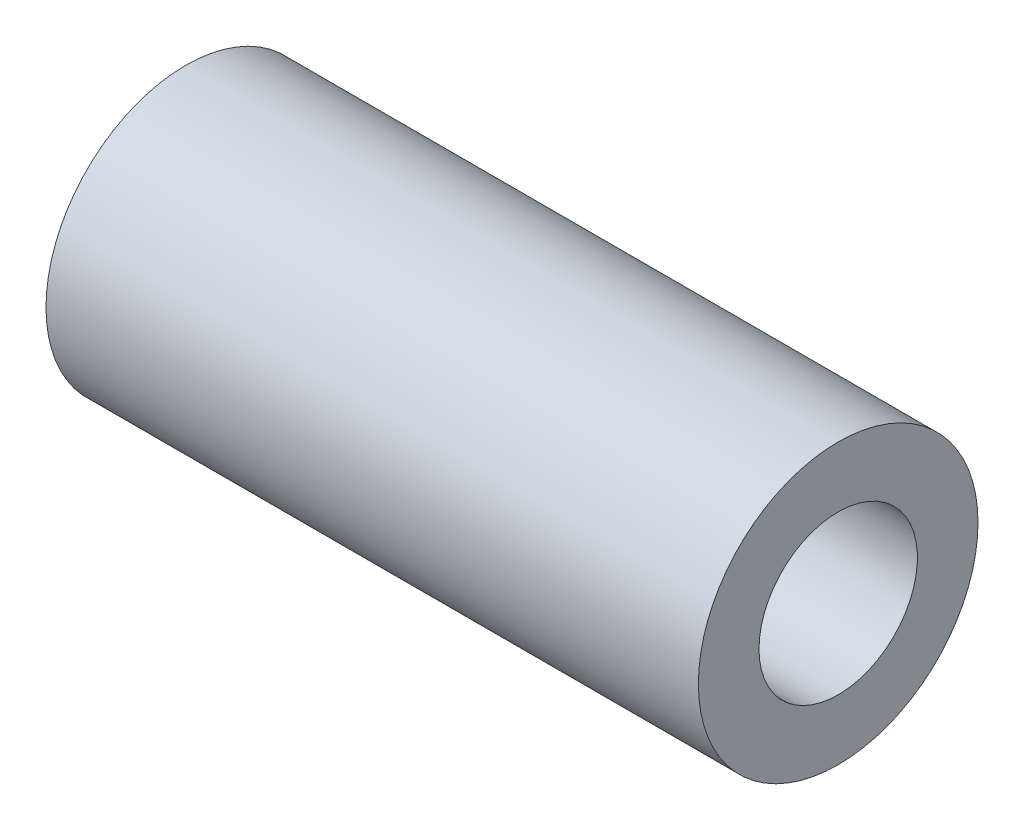
ISO-10303-21;
HEADER;
FILE_DESCRIPTION(('STEP AP214'),'2;1');
FILE_NAME('part.step','',(''),(''),'','','');
FILE_SCHEMA(('AUTOMOTIVE_DESIGN { 1 0 10303 214 1 1 1 1 }'));
ENDSEC;
DATA;
#1=APPLICATION_CONTEXT('core data for automotive mechanical design processes');
#2=APPLICATION_PROTOCOL_DEFINITION('international standard','automotive_design',2000,#1);
#3=PRODUCT_CONTEXT('',#1,'mechanical');
#4=PRODUCT('Part','Part','',(#3));
#5=PRODUCT_RELATED_PRODUCT_CATEGORY('part','',(#4));
#6=PRODUCT_DEFINITION_FORMATION('','',#4);
#7=PRODUCT_DEFINITION_CONTEXT('part definition',#1,'design');
#8=PRODUCT_DEFINITION('design','',#6,#7);
#9=PRODUCT_DEFINITION_SHAPE('','',#8);
#10=(LENGTH_UNIT() NAMED_UNIT(*) SI_UNIT(.MILLI.,.METRE.));
#11=(NAMED_UNIT(*) PLANE_ANGLE_UNIT() SI_UNIT($,.RADIAN.));
#12=(NAMED_UNIT(*) SI_UNIT($,.STERADIAN.) SOLID_ANGLE_UNIT());
#13=UNCERTAINTY_MEASURE_WITH_UNIT(LENGTH_MEASURE(1.E-05),#10,'distance_accuracy_value','');
#14=(GEOMETRIC_REPRESENTATION_CONTEXT(3) GLOBAL_UNCERTAINTY_ASSIGNED_CONTEXT((#13)) GLOBAL_UNIT_ASSIGNED_CONTEXT((#10,
#11,#12)) REPRESENTATION_CONTEXT('',''));
#15=CARTESIAN_POINT('',(0.,0.,0.));
#16=DIRECTION('',(0.,0.,1.));
#17=DIRECTION('',(1.,0.,0.));
#18=AXIS2_PLACEMENT_3D('',#15,#16,#17);
#19=CARTESIAN_POINT('',(-17.,3.,0.));
#20=DIRECTION('',(1.,0.,0.));
#21=DIRECTION('',(0.,0.,-1.));
#22=AXIS2_PLACEMENT_3D('',#19,#20,#21);
#23=PLANE('',#22);
#24=CARTESIAN_POINT('',(-17.,0.,0.));
#25=DIRECTION('',(-1.,0.,0.));
#26=DIRECTION('',(0.,0.,1.));
#27=AXIS2_PLACEMENT_3D('',#24,#25,#26);
#28=CIRCLE('',#27,1.7);
#29=CARTESIAN_POINT('',(-17.,0.,1.7));
#30=VERTEX_POINT('',#29);
#31=EDGE_CURVE('E10',#30,#30,#28,.T.);
#32=ORIENTED_EDGE('',*,*,#31,.F.);
#33=EDGE_LOOP('',(#32));
#34=FACE_BOUND('',#33,.T.);
#35=CARTESIAN_POINT('',(-17.,0.,0.));
#36=DIRECTION('',(-1.,0.,0.));
#37=DIRECTION('',(0.,0.,1.));
#38=AXIS2_PLACEMENT_3D('',#35,#36,#37);
#39=CIRCLE('',#38,3.);
#40=CARTESIAN_POINT('',(-17.,0.,3.));
#41=VERTEX_POINT('',#40);
#42=EDGE_CURVE('E53',#41,#41,#39,.T.);
#43=ORIENTED_EDGE('',*,*,#42,.T.);
#44=EDGE_LOOP('',(#43));
#45=FACE_BOUND('',#44,.T.);
#46=ADVANCED_FACE('F35',(#34,#45),#23,.F.);
#47=CARTESIAN_POINT('',(-60.,0.,0.));
#48=DIRECTION('',(-1.,0.,0.));
#49=DIRECTION('',(0.,0.,1.));
#50=AXIS2_PLACEMENT_3D('',#47,#48,#49);
#51=CYLINDRICAL_SURFACE('',#50,1.7);
#52=CARTESIAN_POINT('',(-3.,0.,0.));
#53=DIRECTION('',(-1.,0.,0.));
#54=DIRECTION('',(0.,0.,1.));
#55=AXIS2_PLACEMENT_3D('',#52,#53,#54);
#56=CIRCLE('',#55,1.7);
#57=CARTESIAN_POINT('',(-3.,0.,1.7));
#58=VERTEX_POINT('',#57);
#59=EDGE_CURVE('E42',#58,#58,#56,.T.);
#60=ORIENTED_EDGE('',*,*,#59,.F.);
#61=EDGE_LOOP('',(#60));
#62=FACE_BOUND('',#61,.T.);
#63=ORIENTED_EDGE('',*,*,#31,.T.);
#64=EDGE_LOOP('',(#63));
#65=FACE_BOUND('',#64,.T.);
#66=ADVANCED_FACE('F68',(#62,#65),#51,.F.);
#67=CARTESIAN_POINT('',(-3.,1.7,0.));
#68=DIRECTION('',(-1.,0.,0.));
#69=DIRECTION('',(0.,0.,1.));
#70=AXIS2_PLACEMENT_3D('',#67,#68,#69);
#71=PLANE('',#70);
#72=CARTESIAN_POINT('',(-3.,0.,0.));
#73=DIRECTION('',(-1.,0.,0.));
#74=DIRECTION('',(0.,0.,1.));
#75=AXIS2_PLACEMENT_3D('',#72,#73,#74);
#76=CIRCLE('',#75,3.);
#77=CARTESIAN_POINT('',(-3.,0.,3.));
#78=VERTEX_POINT('',#77);
#79=EDGE_CURVE('E48',#78,#78,#76,.T.);
#80=ORIENTED_EDGE('',*,*,#79,.F.);
#81=EDGE_LOOP('',(#80));
#82=FACE_BOUND('',#81,.T.);
#83=ORIENTED_EDGE('',*,*,#59,.T.);
#84=EDGE_LOOP('',(#83));
#85=FACE_BOUND('',#84,.T.);
#86=ADVANCED_FACE('F63',(#82,#85),#71,.F.);
#87=CARTESIAN_POINT('',(-60.,0.,0.));
#88=DIRECTION('',(-1.,0.,0.));
#89=DIRECTION('',(0.,0.,1.));
#90=AXIS2_PLACEMENT_3D('',#87,#88,#89);
#91=CYLINDRICAL_SURFACE('',#90,3.);
#92=ORIENTED_EDGE('',*,*,#42,.F.);
#93=EDGE_LOOP('',(#92));
#94=FACE_BOUND('',#93,.T.);
#95=ORIENTED_EDGE('',*,*,#79,.T.);
#96=EDGE_LOOP('',(#95));
#97=FACE_BOUND('',#96,.T.);
#98=ADVANCED_FACE('F60',(#94,#97),#91,.T.);
#99=CLOSED_SHELL('',(#46,#66,#86,#98));
#100=MANIFOLD_SOLID_BREP('B2',#99);
#101=ADVANCED_BREP_SHAPE_REPRESENTATION('',(#18,#100),#14);
#102=SHAPE_DEFINITION_REPRESENTATION(#9,#101);
ENDSEC;
END-ISO-10303-21;
